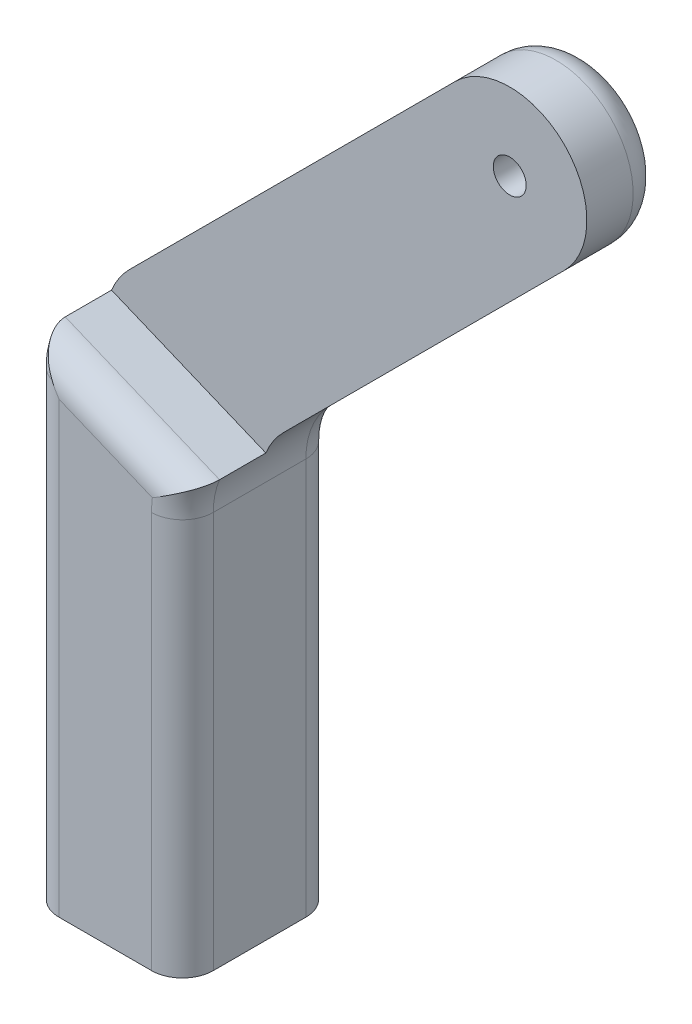
ISO-10303-21;
HEADER;
FILE_DESCRIPTION(('STEP AP214'),'2;1');
FILE_NAME('part.step','',(''),(''),'','','');
FILE_SCHEMA(('AUTOMOTIVE_DESIGN { 1 0 10303 214 1 1 1 1 }'));
ENDSEC;
DATA;
#1=APPLICATION_CONTEXT('core data for automotive mechanical design processes');
#2=APPLICATION_PROTOCOL_DEFINITION('international standard','automotive_design',2000,#1);
#3=PRODUCT_CONTEXT('',#1,'mechanical');
#4=PRODUCT('Part','Part','',(#3));
#5=PRODUCT_RELATED_PRODUCT_CATEGORY('part','',(#4));
#6=PRODUCT_DEFINITION_FORMATION('','',#4);
#7=PRODUCT_DEFINITION_CONTEXT('part definition',#1,'design');
#8=PRODUCT_DEFINITION('design','',#6,#7);
#9=PRODUCT_DEFINITION_SHAPE('','',#8);
#10=(LENGTH_UNIT() NAMED_UNIT(*) SI_UNIT(.MILLI.,.METRE.));
#11=(NAMED_UNIT(*) PLANE_ANGLE_UNIT() SI_UNIT($,.RADIAN.));
#12=(NAMED_UNIT(*) SI_UNIT($,.STERADIAN.) SOLID_ANGLE_UNIT());
#13=UNCERTAINTY_MEASURE_WITH_UNIT(LENGTH_MEASURE(1.E-05),#10,'distance_accuracy_value','');
#14=(GEOMETRIC_REPRESENTATION_CONTEXT(3) GLOBAL_UNCERTAINTY_ASSIGNED_CONTEXT((#13)) GLOBAL_UNIT_ASSIGNED_CONTEXT((#10,
#11,#12)) REPRESENTATION_CONTEXT('',''));
#15=CARTESIAN_POINT('',(0.,0.,0.));
#16=DIRECTION('',(0.,0.,1.));
#17=DIRECTION('',(1.,0.,0.));
#18=AXIS2_PLACEMENT_3D('',#15,#16,#17);
#19=CARTESIAN_POINT('',(152.915954276449,308.759522060909,-0.5));
#20=DIRECTION('',(0.,0.,1.));
#21=DIRECTION('',(1.,0.,0.));
#22=AXIS2_PLACEMENT_3D('',#19,#20,#21);
#23=CYLINDRICAL_SURFACE('',#22,1.59999999999999);
#24=CARTESIAN_POINT('',(152.915954276449,308.759522060909,7.5));
#25=DIRECTION('',(0.,0.,1.));
#26=DIRECTION('',(1.,0.,0.));
#27=AXIS2_PLACEMENT_3D('',#24,#25,#26);
#28=CIRCLE('',#27,1.59999999999999);
#29=CARTESIAN_POINT('',(154.515954276449,308.759522060909,7.5));
#30=VERTEX_POINT('',#29);
#31=EDGE_CURVE('E249',#30,#30,#28,.T.);
#32=ORIENTED_EDGE('',*,*,#31,.T.);
#33=EDGE_LOOP('',(#32));
#34=FACE_BOUND('',#33,.T.);
#35=CARTESIAN_POINT('',(152.915954276449,308.759522060909,3.));
#36=DIRECTION('',(0.,0.,-1.));
#37=DIRECTION('',(-1.,0.,0.));
#38=AXIS2_PLACEMENT_3D('',#35,#36,#37);
#39=CIRCLE('',#38,1.59999999999999);
#40=CARTESIAN_POINT('',(151.315954276449,308.759522060909,3.));
#41=VERTEX_POINT('',#40);
#42=EDGE_CURVE('E241',#41,#41,#39,.F.);
#43=ORIENTED_EDGE('',*,*,#42,.F.);
#44=EDGE_LOOP('',(#43));
#45=FACE_BOUND('',#44,.T.);
#46=ADVANCED_FACE('F35',(#34,#45),#23,.F.);
#47=CARTESIAN_POINT('',(130.939294873562,276.176260940224,15.));
#48=DIRECTION('',(-0.707106781186548,0.707106781186547,0.));
#49=DIRECTION('',(-0.707106781186547,-0.707106781186548,0.));
#50=AXIS2_PLACEMENT_3D('',#47,#48,#49);
#51=PLANE('',#50);
#52=DIRECTION('',(0.,0.,-1.));
#53=VECTOR('',#52,1.);
#54=CARTESIAN_POINT('',(130.939294873562,276.176260940224,15.));
#55=LINE('',#54,#53);
#56=CARTESIAN_POINT('',(130.939294873562,276.176260940224,7.5));
#57=VERTEX_POINT('',#56);
#58=CARTESIAN_POINT('',(130.939294873562,276.176260940224,3.));
#59=VERTEX_POINT('',#58);
#60=EDGE_CURVE('E292',#57,#59,#55,.T.);
#61=ORIENTED_EDGE('',*,*,#60,.T.);
#62=DIRECTION('',(0.707106781186547,0.707106781186548,0.));
#63=VECTOR('',#62,1.);
#64=CARTESIAN_POINT('',(130.939294873562,276.176260940224,3.));
#65=LINE('',#64,#63);
#66=CARTESIAN_POINT('',(158.219255135348,303.45622120201,3.));
#67=VERTEX_POINT('',#66);
#68=EDGE_CURVE('E344',#59,#67,#65,.T.);
#69=ORIENTED_EDGE('',*,*,#68,.T.);
#70=DIRECTION('',(0.,0.,-1.));
#71=VECTOR('',#70,1.);
#72=CARTESIAN_POINT('',(158.219255135348,303.45622120201,15.));
#73=LINE('',#72,#71);
#74=CARTESIAN_POINT('',(158.219255135348,303.45622120201,7.5));
#75=VERTEX_POINT('',#74);
#76=EDGE_CURVE('E289',#75,#67,#73,.T.);
#77=ORIENTED_EDGE('',*,*,#76,.F.);
#78=DIRECTION('',(0.707106781186546,0.707106781186549,0.));
#79=VECTOR('',#78,1.);
#80=CARTESIAN_POINT('',(130.939294873562,276.176260940224,7.5));
#81=LINE('',#80,#79);
#82=EDGE_CURVE('E260',#57,#75,#81,.T.);
#83=ORIENTED_EDGE('',*,*,#82,.F.);
#84=EDGE_LOOP('',(#61,#69,#77,#83));
#85=FACE_BOUND('',#84,.T.);
#86=ADVANCED_FACE('F451',(#85),#51,.F.);
#87=CARTESIAN_POINT('',(152.915954276449,308.759522060909,15.));
#88=DIRECTION('',(0.,0.,-1.));
#89=DIRECTION('',(-1.,0.,0.));
#90=AXIS2_PLACEMENT_3D('',#87,#88,#89);
#91=CYLINDRICAL_SURFACE('',#90,7.49999999999999);
#92=ORIENTED_EDGE('',*,*,#76,.T.);
#93=CARTESIAN_POINT('',(152.915954276449,308.759522060909,3.));
#94=DIRECTION('',(0.,0.,1.));
#95=DIRECTION('',(1.,0.,0.));
#96=AXIS2_PLACEMENT_3D('',#93,#94,#95);
#97=CIRCLE('',#96,7.49999999999999);
#98=CARTESIAN_POINT('',(147.61265341755,314.062822919808,3.));
#99=VERTEX_POINT('',#98);
#100=EDGE_CURVE('E342',#67,#99,#97,.T.);
#101=ORIENTED_EDGE('',*,*,#100,.T.);
#102=DIRECTION('',(0.,0.,-1.));
#103=VECTOR('',#102,1.);
#104=CARTESIAN_POINT('',(147.61265341755,314.062822919808,15.));
#105=LINE('',#104,#103);
#106=CARTESIAN_POINT('',(147.61265341755,314.062822919808,7.5));
#107=VERTEX_POINT('',#106);
#108=EDGE_CURVE('E286',#107,#99,#105,.T.);
#109=ORIENTED_EDGE('',*,*,#108,.F.);
#110=CARTESIAN_POINT('',(152.915954276449,308.759522060909,7.5));
#111=DIRECTION('',(0.,0.,1.));
#112=DIRECTION('',(1.,0.,0.));
#113=AXIS2_PLACEMENT_3D('',#110,#111,#112);
#114=CIRCLE('',#113,7.49999999999998);
#115=EDGE_CURVE('E262',#75,#107,#114,.T.);
#116=ORIENTED_EDGE('',*,*,#115,.F.);
#117=EDGE_LOOP('',(#92,#101,#109,#116));
#118=FACE_BOUND('',#117,.T.);
#119=ADVANCED_FACE('F468',(#118),#91,.T.);
#120=CARTESIAN_POINT('',(115.939294873562,282.38946437582,15.));
#121=DIRECTION('',(0.707106781186548,-0.707106781186547,0.));
#122=DIRECTION('',(0.707106781186547,0.707106781186548,0.));
#123=AXIS2_PLACEMENT_3D('',#120,#121,#122);
#124=PLANE('',#123);
#125=ORIENTED_EDGE('',*,*,#108,.T.);
#126=DIRECTION('',(-0.707106781186547,-0.707106781186548,0.));
#127=VECTOR('',#126,1.);
#128=CARTESIAN_POINT('',(115.939294873562,282.38946437582,3.));
#129=LINE('',#128,#127);
#130=CARTESIAN_POINT('',(115.939294873562,282.38946437582,3.));
#131=VERTEX_POINT('',#130);
#132=EDGE_CURVE('E340',#99,#131,#129,.T.);
#133=ORIENTED_EDGE('',*,*,#132,.T.);
#134=DIRECTION('',(0.,0.,-1.));
#135=VECTOR('',#134,1.);
#136=CARTESIAN_POINT('',(115.939294873562,282.38946437582,15.));
#137=LINE('',#136,#135);
#138=CARTESIAN_POINT('',(115.939294873562,282.38946437582,7.5));
#139=VERTEX_POINT('',#138);
#140=EDGE_CURVE('E281',#139,#131,#137,.T.);
#141=ORIENTED_EDGE('',*,*,#140,.F.);
#142=DIRECTION('',(-0.707106781186547,-0.707106781186548,0.));
#143=VECTOR('',#142,1.);
#144=CARTESIAN_POINT('',(147.61265341755,314.062822919808,7.5));
#145=LINE('',#144,#143);
#146=EDGE_CURVE('E264',#107,#139,#145,.T.);
#147=ORIENTED_EDGE('',*,*,#146,.F.);
#148=EDGE_LOOP('',(#125,#133,#141,#147));
#149=FACE_BOUND('',#148,.T.);
#150=ADVANCED_FACE('F472',(#149),#124,.F.);
#151=CARTESIAN_POINT('',(121.596149123054,276.732610126328,15.));
#152=DIRECTION('',(0.,0.,-1.));
#153=DIRECTION('',(-1.,0.,0.));
#154=AXIS2_PLACEMENT_3D('',#151,#152,#153);
#155=CYLINDRICAL_SURFACE('',#154,7.99999999999997);
#156=ORIENTED_EDGE('',*,*,#140,.T.);
#157=CARTESIAN_POINT('',(121.596149123054,276.732610126328,3.));
#158=DIRECTION('',(0.,0.,1.));
#159=DIRECTION('',(1.,0.,0.));
#160=AXIS2_PLACEMENT_3D('',#157,#158,#159);
#161=CIRCLE('',#160,7.99999999999997);
#162=CARTESIAN_POINT('',(113.596149123054,276.732610126328,3.));
#163=VERTEX_POINT('',#162);
#164=EDGE_CURVE('E338',#131,#163,#161,.T.);
#165=ORIENTED_EDGE('',*,*,#164,.T.);
#166=DIRECTION('',(0.,0.,-1.));
#167=VECTOR('',#166,1.);
#168=CARTESIAN_POINT('',(113.596149123054,276.732610126328,15.));
#169=LINE('',#168,#167);
#170=CARTESIAN_POINT('',(113.596149123054,276.732610126328,12.));
#171=VERTEX_POINT('',#170);
#172=EDGE_CURVE('E304',#171,#163,#169,.T.);
#173=ORIENTED_EDGE('',*,*,#172,.F.);
#174=CARTESIAN_POINT('',(121.596149123054,276.732610126328,12.));
#175=DIRECTION('',(0.,0.,1.));
#176=DIRECTION('',(1.,0.,0.));
#177=AXIS2_PLACEMENT_3D('',#174,#175,#176);
#178=CIRCLE('',#177,7.99999999999997);
#179=CARTESIAN_POINT('',(114.205112862964,279.794077585248,12.));
#180=VERTEX_POINT('',#179);
#181=EDGE_CURVE('E336',#171,#180,#178,.F.);
#182=ORIENTED_EDGE('',*,*,#181,.T.);
#183=DIRECTION('',(0.,0.,1.));
#184=VECTOR('',#183,1.);
#185=CARTESIAN_POINT('',(114.205112862964,279.794077585248,7.5));
#186=LINE('',#185,#184);
#187=CARTESIAN_POINT('',(114.205112862964,279.794077585248,7.5));
#188=VERTEX_POINT('',#187);
#189=EDGE_CURVE('E266',#188,#180,#186,.T.);
#190=ORIENTED_EDGE('',*,*,#189,.F.);
#191=CARTESIAN_POINT('',(121.596149123054,276.732610126328,7.5));
#192=DIRECTION('',(0.,0.,1.));
#193=DIRECTION('',(1.,0.,0.));
#194=AXIS2_PLACEMENT_3D('',#191,#192,#193);
#195=CIRCLE('',#194,7.99999999999997);
#196=EDGE_CURVE('E252',#139,#188,#195,.T.);
#197=ORIENTED_EDGE('',*,*,#196,.F.);
#198=EDGE_LOOP('',(#156,#165,#173,#182,#190,#197));
#199=FACE_BOUND('',#198,.T.);
#200=ADVANCED_FACE('F478',(#199),#155,.T.);
#201=CARTESIAN_POINT('',(113.596149123054,231.939716907514,15.));
#202=DIRECTION('',(1.,0.,0.));
#203=DIRECTION('',(0.,0.,-1.));
#204=AXIS2_PLACEMENT_3D('',#201,#202,#203);
#205=PLANE('',#204);
#206=ORIENTED_EDGE('',*,*,#172,.T.);
#207=DIRECTION('',(0.,-1.,0.));
#208=VECTOR('',#207,1.);
#209=CARTESIAN_POINT('',(113.596149123054,231.939716907514,3.));
#210=LINE('',#209,#208);
#211=CARTESIAN_POINT('',(113.596149123054,231.939716907514,3.));
#212=VERTEX_POINT('',#211);
#213=EDGE_CURVE('E311',#163,#212,#210,.T.);
#214=ORIENTED_EDGE('',*,*,#213,.T.);
#215=DIRECTION('',(0.,0.,-1.));
#216=VECTOR('',#215,1.);
#217=CARTESIAN_POINT('',(113.596149123054,231.939716907514,15.));
#218=LINE('',#217,#216);
#219=CARTESIAN_POINT('',(113.596149123054,231.939716907514,12.));
#220=VERTEX_POINT('',#219);
#221=EDGE_CURVE('E301',#220,#212,#218,.T.);
#222=ORIENTED_EDGE('',*,*,#221,.F.);
#223=DIRECTION('',(0.,-1.,0.));
#224=VECTOR('',#223,1.);
#225=CARTESIAN_POINT('',(113.596149123054,276.732610126328,12.));
#226=LINE('',#225,#224);
#227=EDGE_CURVE('E307',#220,#171,#226,.F.);
#228=ORIENTED_EDGE('',*,*,#227,.T.);
#229=EDGE_LOOP('',(#206,#214,#222,#228));
#230=FACE_BOUND('',#229,.T.);
#231=ADVANCED_FACE('F484',(#230),#205,.F.);
#232=CARTESIAN_POINT('',(113.596149123054,231.939716907514,15.));
#233=DIRECTION('',(0.,1.,0.));
#234=DIRECTION('',(0.,0.,1.));
#235=AXIS2_PLACEMENT_3D('',#232,#233,#234);
#236=PLANE('',#235);
#237=CARTESIAN_POINT('',(121.096149123054,231.939716907514,7.5));
#238=DIRECTION('',(0.,-1.,0.));
#239=DIRECTION('',(0.,0.,-1.));
#240=AXIS2_PLACEMENT_3D('',#237,#238,#239);
#241=CIRCLE('',#240,3.1);
#242=CARTESIAN_POINT('',(121.096149123054,231.939716907514,4.4));
#243=VERTEX_POINT('',#242);
#244=EDGE_CURVE('E270',#243,#243,#241,.T.);
#245=ORIENTED_EDGE('',*,*,#244,.F.);
#246=EDGE_LOOP('',(#245));
#247=FACE_BOUND('',#246,.T.);
#248=ORIENTED_EDGE('',*,*,#221,.T.);
#249=CARTESIAN_POINT('',(116.596149123054,231.939716907514,3.));
#250=DIRECTION('',(0.,1.,0.));
#251=DIRECTION('',(0.,0.,1.));
#252=AXIS2_PLACEMENT_3D('',#249,#250,#251);
#253=CIRCLE('',#252,3.);
#254=CARTESIAN_POINT('',(116.596149123054,231.939716907514,0.));
#255=VERTEX_POINT('',#254);
#256=EDGE_CURVE('E320',#212,#255,#253,.F.);
#257=ORIENTED_EDGE('',*,*,#256,.T.);
#258=DIRECTION('',(1.,0.,0.));
#259=VECTOR('',#258,1.);
#260=CARTESIAN_POINT('',(113.596149123054,231.939716907514,0.));
#261=LINE('',#260,#259);
#262=CARTESIAN_POINT('',(125.596149123054,231.939716907514,0.));
#263=VERTEX_POINT('',#262);
#264=EDGE_CURVE('E276',#255,#263,#261,.T.);
#265=ORIENTED_EDGE('',*,*,#264,.T.);
#266=CARTESIAN_POINT('',(125.596149123054,231.939716907514,3.));
#267=DIRECTION('',(0.,1.,0.));
#268=DIRECTION('',(0.,0.,1.));
#269=AXIS2_PLACEMENT_3D('',#266,#267,#268);
#270=CIRCLE('',#269,3.);
#271=CARTESIAN_POINT('',(128.596149123054,231.939716907514,3.));
#272=VERTEX_POINT('',#271);
#273=EDGE_CURVE('E318',#263,#272,#270,.F.);
#274=ORIENTED_EDGE('',*,*,#273,.T.);
#275=DIRECTION('',(0.,0.,-1.));
#276=VECTOR('',#275,1.);
#277=CARTESIAN_POINT('',(128.596149123054,231.939716907514,15.));
#278=LINE('',#277,#276);
#279=CARTESIAN_POINT('',(128.596149123054,231.939716907514,12.));
#280=VERTEX_POINT('',#279);
#281=EDGE_CURVE('E298',#280,#272,#278,.T.);
#282=ORIENTED_EDGE('',*,*,#281,.F.);
#283=CARTESIAN_POINT('',(125.596149123054,231.939716907514,12.));
#284=DIRECTION('',(0.,1.,0.));
#285=DIRECTION('',(0.,0.,1.));
#286=AXIS2_PLACEMENT_3D('',#283,#284,#285);
#287=CIRCLE('',#286,3.);
#288=CARTESIAN_POINT('',(125.596149123054,231.939716907514,15.));
#289=VERTEX_POINT('',#288);
#290=EDGE_CURVE('E316',#280,#289,#287,.F.);
#291=ORIENTED_EDGE('',*,*,#290,.T.);
#292=DIRECTION('',(1.,0.,0.));
#293=VECTOR('',#292,1.);
#294=CARTESIAN_POINT('',(113.596149123054,231.939716907514,15.));
#295=LINE('',#294,#293);
#296=CARTESIAN_POINT('',(116.596149123054,231.939716907514,15.));
#297=VERTEX_POINT('',#296);
#298=EDGE_CURVE('E279',#297,#289,#295,.T.);
#299=ORIENTED_EDGE('',*,*,#298,.F.);
#300=CARTESIAN_POINT('',(116.596149123054,231.939716907514,12.));
#301=DIRECTION('',(0.,1.,0.));
#302=DIRECTION('',(0.,0.,1.));
#303=AXIS2_PLACEMENT_3D('',#300,#301,#302);
#304=CIRCLE('',#303,3.);
#305=EDGE_CURVE('E314',#297,#220,#304,.F.);
#306=ORIENTED_EDGE('',*,*,#305,.T.);
#307=EDGE_LOOP('',(#248,#257,#265,#274,#282,#291,#299,#306));
#308=FACE_BOUND('',#307,.T.);
#309=ADVANCED_FACE('F438',(#247,#308),#236,.F.);
#310=CARTESIAN_POINT('',(128.596149123054,231.939716907514,15.));
#311=DIRECTION('',(-1.,0.,0.));
#312=DIRECTION('',(0.,0.,1.));
#313=AXIS2_PLACEMENT_3D('',#310,#311,#312);
#314=PLANE('',#313);
#315=ORIENTED_EDGE('',*,*,#281,.T.);
#316=DIRECTION('',(0.,1.,0.));
#317=VECTOR('',#316,1.);
#318=CARTESIAN_POINT('',(128.596149123054,231.939716907514,3.));
#319=LINE('',#318,#317);
#320=CARTESIAN_POINT('',(128.596149123054,270.519406690731,3.));
#321=VERTEX_POINT('',#320);
#322=EDGE_CURVE('E45',#272,#321,#319,.T.);
#323=ORIENTED_EDGE('',*,*,#322,.T.);
#324=DIRECTION('',(0.,0.,-1.));
#325=VECTOR('',#324,1.);
#326=CARTESIAN_POINT('',(128.596149123054,270.519406690731,15.));
#327=LINE('',#326,#325);
#328=CARTESIAN_POINT('',(128.596149123054,270.519406690731,12.));
#329=VERTEX_POINT('',#328);
#330=EDGE_CURVE('E295',#329,#321,#327,.T.);
#331=ORIENTED_EDGE('',*,*,#330,.F.);
#332=DIRECTION('',(0.,1.,0.));
#333=VECTOR('',#332,1.);
#334=CARTESIAN_POINT('',(128.596149123054,231.939716907514,12.));
#335=LINE('',#334,#333);
#336=EDGE_CURVE('E357',#329,#280,#335,.F.);
#337=ORIENTED_EDGE('',*,*,#336,.T.);
#338=EDGE_LOOP('',(#315,#323,#331,#337));
#339=FACE_BOUND('',#338,.T.);
#340=ADVANCED_FACE('F435',(#339),#314,.F.);
#341=CARTESIAN_POINT('',(136.596149123054,270.519406690731,15.));
#342=DIRECTION('',(0.,0.,-1.));
#343=DIRECTION('',(-1.,0.,0.));
#344=AXIS2_PLACEMENT_3D('',#341,#342,#343);
#345=CYLINDRICAL_SURFACE('',#344,7.99999999999999);
#346=ORIENTED_EDGE('',*,*,#330,.T.);
#347=CARTESIAN_POINT('',(136.596149123054,270.519406690731,3.));
#348=DIRECTION('',(0.,0.,1.));
#349=DIRECTION('',(1.,0.,0.));
#350=AXIS2_PLACEMENT_3D('',#347,#348,#349);
#351=CIRCLE('',#350,7.99999999999999);
#352=EDGE_CURVE('E348',#321,#59,#351,.F.);
#353=ORIENTED_EDGE('',*,*,#352,.T.);
#354=ORIENTED_EDGE('',*,*,#60,.F.);
#355=CARTESIAN_POINT('',(136.596149123054,270.519406690731,7.5));
#356=DIRECTION('',(0.,0.,-1.));
#357=DIRECTION('',(1.,0.,0.));
#358=AXIS2_PLACEMENT_3D('',#355,#356,#357);
#359=CIRCLE('',#358,7.99999999999998);
#360=CARTESIAN_POINT('',(129.205112862964,273.580874149652,7.5));
#361=VERTEX_POINT('',#360);
#362=EDGE_CURVE('E258',#361,#57,#359,.T.);
#363=ORIENTED_EDGE('',*,*,#362,.F.);
#364=DIRECTION('',(0.,0.,1.));
#365=VECTOR('',#364,1.);
#366=CARTESIAN_POINT('',(129.205112862964,273.580874149652,7.5));
#367=LINE('',#366,#365);
#368=CARTESIAN_POINT('',(129.205112862964,273.580874149652,12.));
#369=VERTEX_POINT('',#368);
#370=EDGE_CURVE('E267',#361,#369,#367,.T.);
#371=ORIENTED_EDGE('',*,*,#370,.T.);
#372=CARTESIAN_POINT('',(136.596149123054,270.519406690731,12.));
#373=DIRECTION('',(0.,0.,1.));
#374=DIRECTION('',(1.,0.,0.));
#375=AXIS2_PLACEMENT_3D('',#372,#373,#374);
#376=CIRCLE('',#375,7.99999999999999);
#377=EDGE_CURVE('E346',#369,#329,#376,.T.);
#378=ORIENTED_EDGE('',*,*,#377,.T.);
#379=EDGE_LOOP('',(#346,#353,#354,#363,#371,#378));
#380=FACE_BOUND('',#379,.T.);
#381=ADVANCED_FACE('F424',(#380),#345,.F.);
#382=CARTESIAN_POINT('',(121.596149123054,276.732610126328,15.));
#383=DIRECTION('',(0.,0.,1.));
#384=DIRECTION('',(1.,0.,0.));
#385=AXIS2_PLACEMENT_3D('',#382,#383,#384);
#386=PLANE('',#385);
#387=ORIENTED_EDGE('',*,*,#298,.T.);
#388=DIRECTION('',(0.,1.,0.));
#389=VECTOR('',#388,1.);
#390=CARTESIAN_POINT('',(125.596149123054,270.519406690731,15.));
#391=LINE('',#390,#389);
#392=CARTESIAN_POINT('',(125.596149123054,270.519406690731,15.));
#393=VERTEX_POINT('',#392);
#394=EDGE_CURVE('E53',#289,#393,#391,.T.);
#395=ORIENTED_EDGE('',*,*,#394,.T.);
#396=CARTESIAN_POINT('',(136.596149123054,270.519406690731,15.));
#397=DIRECTION('',(0.,0.,1.));
#398=DIRECTION('',(1.,0.,0.));
#399=AXIS2_PLACEMENT_3D('',#396,#397,#398);
#400=CIRCLE('',#399,11.);
#401=CARTESIAN_POINT('',(125.670676888329,271.797708864808,15.));
#402=VERTEX_POINT('',#401);
#403=EDGE_CURVE('E354',#393,#402,#400,.F.);
#404=ORIENTED_EDGE('',*,*,#403,.T.);
#405=DIRECTION('',(0.923879532511286,-0.382683432365091,0.));
#406=VECTOR('',#405,1.);
#407=CARTESIAN_POINT('',(113.057062565869,277.022438987715,15.));
#408=LINE('',#407,#406);
#409=CARTESIAN_POINT('',(116.596149123054,275.556501337316,15.));
#410=VERTEX_POINT('',#409);
#411=EDGE_CURVE('E352',#402,#410,#408,.F.);
#412=ORIENTED_EDGE('',*,*,#411,.T.);
#413=DIRECTION('',(0.,-1.,0.));
#414=VECTOR('',#413,1.);
#415=CARTESIAN_POINT('',(116.596149123054,231.939716907514,15.));
#416=LINE('',#415,#414);
#417=EDGE_CURVE('E350',#410,#297,#416,.T.);
#418=ORIENTED_EDGE('',*,*,#417,.T.);
#419=EDGE_LOOP('',(#387,#395,#404,#412,#418));
#420=FACE_BOUND('',#419,.T.);
#421=ADVANCED_FACE('F530',(#420),#386,.T.);
#422=CARTESIAN_POINT('',(121.596149123054,276.732610126328,0.));
#423=DIRECTION('',(0.,0.,1.));
#424=DIRECTION('',(1.,0.,0.));
#425=AXIS2_PLACEMENT_3D('',#422,#423,#424);
#426=PLANE('',#425);
#427=DIRECTION('',(0.499999999999996,0.866025403784441,0.));
#428=VECTOR('',#427,1.);
#429=CARTESIAN_POINT('',(149.682792768987,308.759522060909,0.));
#430=LINE('',#429,#428);
#431=CARTESIAN_POINT('',(149.682792768987,308.759522060909,0.));
#432=VERTEX_POINT('',#431);
#433=CARTESIAN_POINT('',(151.299373522718,311.559522060909,0.));
#434=VERTEX_POINT('',#433);
#435=EDGE_CURVE('E228',#432,#434,#430,.T.);
#436=ORIENTED_EDGE('',*,*,#435,.F.);
#437=DIRECTION('',(-0.500000000000001,0.866025403784438,0.));
#438=VECTOR('',#437,1.);
#439=CARTESIAN_POINT('',(151.299373522718,305.959522060909,0.));
#440=LINE('',#439,#438);
#441=CARTESIAN_POINT('',(151.299373522718,305.959522060909,0.));
#442=VERTEX_POINT('',#441);
#443=EDGE_CURVE('E195',#442,#432,#440,.T.);
#444=ORIENTED_EDGE('',*,*,#443,.F.);
#445=DIRECTION('',(-1.,0.,0.));
#446=VECTOR('',#445,1.);
#447=CARTESIAN_POINT('',(154.53253503018,305.959522060909,0.));
#448=LINE('',#447,#446);
#449=CARTESIAN_POINT('',(154.53253503018,305.959522060909,0.));
#450=VERTEX_POINT('',#449);
#451=EDGE_CURVE('E214',#450,#442,#448,.T.);
#452=ORIENTED_EDGE('',*,*,#451,.F.);
#453=DIRECTION('',(-0.499999999999995,-0.866025403784441,0.));
#454=VECTOR('',#453,1.);
#455=CARTESIAN_POINT('',(156.149115783911,308.759522060909,0.));
#456=LINE('',#455,#454);
#457=CARTESIAN_POINT('',(156.149115783911,308.759522060909,0.));
#458=VERTEX_POINT('',#457);
#459=EDGE_CURVE('E217',#458,#450,#456,.T.);
#460=ORIENTED_EDGE('',*,*,#459,.F.);
#461=DIRECTION('',(0.499999999999996,-0.866025403784441,0.));
#462=VECTOR('',#461,1.);
#463=CARTESIAN_POINT('',(154.53253503018,311.559522060909,0.));
#464=LINE('',#463,#462);
#465=CARTESIAN_POINT('',(154.53253503018,311.559522060909,0.));
#466=VERTEX_POINT('',#465);
#467=EDGE_CURVE('E234',#466,#458,#464,.T.);
#468=ORIENTED_EDGE('',*,*,#467,.F.);
#469=DIRECTION('',(1.,0.,0.));
#470=VECTOR('',#469,1.);
#471=CARTESIAN_POINT('',(151.299373522718,311.559522060909,0.));
#472=LINE('',#471,#470);
#473=EDGE_CURVE('E231',#434,#466,#472,.T.);
#474=ORIENTED_EDGE('',*,*,#473,.F.);
#475=EDGE_LOOP('',(#436,#444,#452,#460,#468,#474));
#476=FACE_BOUND('',#475,.T.);
#477=ORIENTED_EDGE('',*,*,#264,.F.);
#478=DIRECTION('',(0.,-1.,0.));
#479=VECTOR('',#478,1.);
#480=CARTESIAN_POINT('',(116.596149123054,276.732610126328,0.));
#481=LINE('',#480,#479);
#482=CARTESIAN_POINT('',(116.596149123054,276.732610126328,0.));
#483=VERTEX_POINT('',#482);
#484=EDGE_CURVE('E334',#255,#483,#481,.F.);
#485=ORIENTED_EDGE('',*,*,#484,.T.);
#486=CARTESIAN_POINT('',(121.596149123054,276.732610126328,0.));
#487=DIRECTION('',(0.,0.,1.));
#488=DIRECTION('',(1.,0.,0.));
#489=AXIS2_PLACEMENT_3D('',#486,#487,#488);
#490=CIRCLE('',#489,4.99999999999997);
#491=CARTESIAN_POINT('',(118.060615217122,280.26814403226,0.));
#492=VERTEX_POINT('',#491);
#493=EDGE_CURVE('E332',#483,#492,#490,.F.);
#494=ORIENTED_EDGE('',*,*,#493,.T.);
#495=DIRECTION('',(-0.707106781186547,-0.707106781186548,0.));
#496=VECTOR('',#495,1.);
#497=CARTESIAN_POINT('',(118.060615217122,280.26814403226,0.));
#498=LINE('',#497,#496);
#499=CARTESIAN_POINT('',(149.73397376111,311.941502576248,0.));
#500=VERTEX_POINT('',#499);
#501=EDGE_CURVE('E330',#492,#500,#498,.F.);
#502=ORIENTED_EDGE('',*,*,#501,.T.);
#503=CARTESIAN_POINT('',(152.915954276449,308.759522060909,0.));
#504=DIRECTION('',(0.,0.,1.));
#505=DIRECTION('',(1.,0.,0.));
#506=AXIS2_PLACEMENT_3D('',#503,#504,#505);
#507=CIRCLE('',#506,4.49999999999999);
#508=CARTESIAN_POINT('',(156.097934791788,305.577541545569,0.));
#509=VERTEX_POINT('',#508);
#510=EDGE_CURVE('E328',#500,#509,#507,.F.);
#511=ORIENTED_EDGE('',*,*,#510,.T.);
#512=DIRECTION('',(0.707106781186547,0.707106781186548,0.));
#513=VECTOR('',#512,1.);
#514=CARTESIAN_POINT('',(124.424576247801,273.904183001582,0.));
#515=LINE('',#514,#513);
#516=CARTESIAN_POINT('',(128.817974530002,278.297581283783,0.));
#517=VERTEX_POINT('',#516);
#518=EDGE_CURVE('E326',#509,#517,#515,.F.);
#519=ORIENTED_EDGE('',*,*,#518,.T.);
#520=CARTESIAN_POINT('',(136.596149123054,270.519406690731,0.));
#521=DIRECTION('',(0.,0.,1.));
#522=DIRECTION('',(1.,0.,0.));
#523=AXIS2_PLACEMENT_3D('',#520,#521,#522);
#524=CIRCLE('',#523,11.);
#525=CARTESIAN_POINT('',(125.596149123054,270.519406690731,0.));
#526=VERTEX_POINT('',#525);
#527=EDGE_CURVE('E324',#517,#526,#524,.T.);
#528=ORIENTED_EDGE('',*,*,#527,.T.);
#529=DIRECTION('',(0.,1.,0.));
#530=VECTOR('',#529,1.);
#531=CARTESIAN_POINT('',(125.596149123054,276.732610126328,0.));
#532=LINE('',#531,#530);
#533=EDGE_CURVE('E322',#526,#263,#532,.F.);
#534=ORIENTED_EDGE('',*,*,#533,.T.);
#535=EDGE_LOOP('',(#477,#485,#494,#502,#511,#519,#528,#534));
#536=FACE_BOUND('',#535,.T.);
#537=ADVANCED_FACE('F494',(#476,#536),#426,.F.);
#538=CARTESIAN_POINT('',(121.096149123054,243.939716907514,7.5));
#539=DIRECTION('',(0.,-1.,0.));
#540=DIRECTION('',(0.,0.,-1.));
#541=AXIS2_PLACEMENT_3D('',#538,#539,#540);
#542=CYLINDRICAL_SURFACE('',#541,3.1);
#543=CARTESIAN_POINT('',(121.096149123054,243.939716907514,7.5));
#544=DIRECTION('',(0.,-1.,0.));
#545=DIRECTION('',(0.,0.,-1.));
#546=AXIS2_PLACEMENT_3D('',#543,#544,#545);
#547=CIRCLE('',#546,3.1);
#548=CARTESIAN_POINT('',(121.096149123054,243.939716907514,4.4));
#549=VERTEX_POINT('',#548);
#550=EDGE_CURVE('E273',#549,#549,#547,.T.);
#551=ORIENTED_EDGE('',*,*,#550,.F.);
#552=EDGE_LOOP('',(#551));
#553=FACE_BOUND('',#552,.T.);
#554=ORIENTED_EDGE('',*,*,#244,.T.);
#555=EDGE_LOOP('',(#554));
#556=FACE_BOUND('',#555,.T.);
#557=ADVANCED_FACE('F525',(#553,#556),#542,.F.);
#558=CARTESIAN_POINT('',(121.096149123054,243.939716907514,7.5));
#559=DIRECTION('',(0.,-1.,0.));
#560=DIRECTION('',(0.,0.,-1.));
#561=AXIS2_PLACEMENT_3D('',#558,#559,#560);
#562=PLANE('',#561);
#563=ORIENTED_EDGE('',*,*,#550,.T.);
#564=EDGE_LOOP('',(#563));
#565=FACE_BOUND('',#564,.T.);
#566=ADVANCED_FACE('F522',(#565),#562,.T.);
#567=CARTESIAN_POINT('',(114.205112862964,279.794077585248,7.5));
#568=DIRECTION('',(-0.382683432365091,-0.923879532511286,0.));
#569=DIRECTION('',(0.923879532511286,-0.382683432365091,0.));
#570=AXIS2_PLACEMENT_3D('',#567,#568,#569);
#571=PLANE('',#570);
#572=ORIENTED_EDGE('',*,*,#189,.T.);
#573=DIRECTION('',(0.923879532511286,-0.382683432365091,0.));
#574=VECTOR('',#573,1.);
#575=CARTESIAN_POINT('',(129.205112862964,273.580874149652,12.));
#576=LINE('',#575,#574);
#577=EDGE_CURVE('E11',#180,#369,#576,.T.);
#578=ORIENTED_EDGE('',*,*,#577,.T.);
#579=ORIENTED_EDGE('',*,*,#370,.F.);
#580=DIRECTION('',(0.923879532511286,-0.382683432365091,0.));
#581=VECTOR('',#580,1.);
#582=CARTESIAN_POINT('',(114.205112862964,279.794077585248,7.5));
#583=LINE('',#582,#581);
#584=EDGE_CURVE('E255',#188,#361,#583,.T.);
#585=ORIENTED_EDGE('',*,*,#584,.F.);
#586=EDGE_LOOP('',(#572,#578,#579,#585));
#587=FACE_BOUND('',#586,.T.);
#588=ADVANCED_FACE('F419',(#587),#571,.F.);
#589=CARTESIAN_POINT('',(121.596149123054,276.732610126328,7.5));
#590=DIRECTION('',(0.,0.,1.));
#591=DIRECTION('',(1.,0.,0.));
#592=AXIS2_PLACEMENT_3D('',#589,#590,#591);
#593=PLANE('',#592);
#594=ORIENTED_EDGE('',*,*,#31,.F.);
#595=EDGE_LOOP('',(#594));
#596=FACE_BOUND('',#595,.T.);
#597=ORIENTED_EDGE('',*,*,#196,.T.);
#598=ORIENTED_EDGE('',*,*,#584,.T.);
#599=ORIENTED_EDGE('',*,*,#362,.T.);
#600=ORIENTED_EDGE('',*,*,#82,.T.);
#601=ORIENTED_EDGE('',*,*,#115,.T.);
#602=ORIENTED_EDGE('',*,*,#146,.T.);
#603=EDGE_LOOP('',(#597,#598,#599,#600,#601,#602));
#604=FACE_BOUND('',#603,.T.);
#605=ADVANCED_FACE('F476',(#596,#604),#593,.T.);
#606=CARTESIAN_POINT('',(0.,0.,3.));
#607=DIRECTION('',(0.,0.,-1.));
#608=DIRECTION('',(-1.,0.,0.));
#609=AXIS2_PLACEMENT_3D('',#606,#607,#608);
#610=PLANE('',#609);
#611=DIRECTION('',(-0.500000000000001,0.866025403784438,0.));
#612=VECTOR('',#611,1.);
#613=CARTESIAN_POINT('',(151.299373522718,305.959522060909,3.));
#614=LINE('',#613,#612);
#615=CARTESIAN_POINT('',(151.299373522718,305.959522060909,3.));
#616=VERTEX_POINT('',#615);
#617=CARTESIAN_POINT('',(149.682792768987,308.759522060909,3.));
#618=VERTEX_POINT('',#617);
#619=EDGE_CURVE('E192',#616,#618,#614,.T.);
#620=ORIENTED_EDGE('',*,*,#619,.T.);
#621=DIRECTION('',(0.499999999999996,0.866025403784441,0.));
#622=VECTOR('',#621,1.);
#623=CARTESIAN_POINT('',(149.682792768987,308.759522060909,3.));
#624=LINE('',#623,#622);
#625=CARTESIAN_POINT('',(151.299373522718,311.559522060909,3.));
#626=VERTEX_POINT('',#625);
#627=EDGE_CURVE('E203',#618,#626,#624,.T.);
#628=ORIENTED_EDGE('',*,*,#627,.T.);
#629=DIRECTION('',(1.,0.,0.));
#630=VECTOR('',#629,1.);
#631=CARTESIAN_POINT('',(151.299373522718,311.559522060909,3.));
#632=LINE('',#631,#630);
#633=CARTESIAN_POINT('',(154.53253503018,311.559522060909,3.));
#634=VERTEX_POINT('',#633);
#635=EDGE_CURVE('E208',#626,#634,#632,.T.);
#636=ORIENTED_EDGE('',*,*,#635,.T.);
#637=DIRECTION('',(0.499999999999996,-0.866025403784441,0.));
#638=VECTOR('',#637,1.);
#639=CARTESIAN_POINT('',(154.53253503018,311.559522060909,3.));
#640=LINE('',#639,#638);
#641=CARTESIAN_POINT('',(156.149115783911,308.759522060909,3.));
#642=VERTEX_POINT('',#641);
#643=EDGE_CURVE('E221',#634,#642,#640,.T.);
#644=ORIENTED_EDGE('',*,*,#643,.T.);
#645=DIRECTION('',(-0.499999999999995,-0.866025403784441,0.));
#646=VECTOR('',#645,1.);
#647=CARTESIAN_POINT('',(156.149115783911,308.759522060909,3.));
#648=LINE('',#647,#646);
#649=CARTESIAN_POINT('',(154.53253503018,305.959522060909,3.));
#650=VERTEX_POINT('',#649);
#651=EDGE_CURVE('E224',#642,#650,#648,.T.);
#652=ORIENTED_EDGE('',*,*,#651,.T.);
#653=DIRECTION('',(-1.,0.,0.));
#654=VECTOR('',#653,1.);
#655=CARTESIAN_POINT('',(154.53253503018,305.959522060909,3.));
#656=LINE('',#655,#654);
#657=EDGE_CURVE('E200',#650,#616,#656,.T.);
#658=ORIENTED_EDGE('',*,*,#657,.T.);
#659=EDGE_LOOP('',(#620,#628,#636,#644,#652,#658));
#660=FACE_BOUND('',#659,.T.);
#661=ORIENTED_EDGE('',*,*,#42,.T.);
#662=EDGE_LOOP('',(#661));
#663=FACE_BOUND('',#662,.T.);
#664=ADVANCED_FACE('F210',(#660,#663),#610,.T.);
#665=CARTESIAN_POINT('',(151.299373522718,305.959522060909,3.));
#666=DIRECTION('',(-0.866025403784438,-0.500000000000002,0.));
#667=DIRECTION('',(0.500000000000002,-0.866025403784438,0.));
#668=AXIS2_PLACEMENT_3D('',#665,#666,#667);
#669=PLANE('',#668);
#670=ORIENTED_EDGE('',*,*,#443,.T.);
#671=DIRECTION('',(0.,0.,-1.));
#672=VECTOR('',#671,1.);
#673=CARTESIAN_POINT('',(149.682792768987,308.759522060909,3.));
#674=LINE('',#673,#672);
#675=EDGE_CURVE('E188',#618,#432,#674,.T.);
#676=ORIENTED_EDGE('',*,*,#675,.F.);
#677=ORIENTED_EDGE('',*,*,#619,.F.);
#678=DIRECTION('',(0.,0.,-1.));
#679=VECTOR('',#678,1.);
#680=CARTESIAN_POINT('',(151.299373522718,305.959522060909,3.));
#681=LINE('',#680,#679);
#682=EDGE_CURVE('E239',#616,#442,#681,.T.);
#683=ORIENTED_EDGE('',*,*,#682,.T.);
#684=EDGE_LOOP('',(#670,#676,#677,#683));
#685=FACE_BOUND('',#684,.T.);
#686=ADVANCED_FACE('F190',(#685),#669,.F.);
#687=CARTESIAN_POINT('',(154.53253503018,305.959522060909,3.));
#688=DIRECTION('',(0.,-1.,0.));
#689=DIRECTION('',(0.,0.,-1.));
#690=AXIS2_PLACEMENT_3D('',#687,#688,#689);
#691=PLANE('',#690);
#692=ORIENTED_EDGE('',*,*,#451,.T.);
#693=ORIENTED_EDGE('',*,*,#682,.F.);
#694=ORIENTED_EDGE('',*,*,#657,.F.);
#695=DIRECTION('',(0.,0.,-1.));
#696=VECTOR('',#695,1.);
#697=CARTESIAN_POINT('',(154.53253503018,305.959522060909,3.));
#698=LINE('',#697,#696);
#699=EDGE_CURVE('E242',#650,#450,#698,.T.);
#700=ORIENTED_EDGE('',*,*,#699,.T.);
#701=EDGE_LOOP('',(#692,#693,#694,#700));
#702=FACE_BOUND('',#701,.T.);
#703=ADVANCED_FACE('F659',(#702),#691,.F.);
#704=CARTESIAN_POINT('',(156.149115783911,308.759522060909,3.));
#705=DIRECTION('',(0.866025403784441,-0.499999999999995,0.));
#706=DIRECTION('',(0.499999999999995,0.866025403784441,0.));
#707=AXIS2_PLACEMENT_3D('',#704,#705,#706);
#708=PLANE('',#707);
#709=ORIENTED_EDGE('',*,*,#459,.T.);
#710=ORIENTED_EDGE('',*,*,#699,.F.);
#711=ORIENTED_EDGE('',*,*,#651,.F.);
#712=DIRECTION('',(0.,0.,-1.));
#713=VECTOR('',#712,1.);
#714=CARTESIAN_POINT('',(156.149115783911,308.759522060909,3.));
#715=LINE('',#714,#713);
#716=EDGE_CURVE('E244',#642,#458,#715,.T.);
#717=ORIENTED_EDGE('',*,*,#716,.T.);
#718=EDGE_LOOP('',(#709,#710,#711,#717));
#719=FACE_BOUND('',#718,.T.);
#720=ADVANCED_FACE('F650',(#719),#708,.F.);
#721=CARTESIAN_POINT('',(154.53253503018,311.559522060909,3.));
#722=DIRECTION('',(0.866025403784441,0.499999999999996,0.));
#723=DIRECTION('',(-0.499999999999996,0.866025403784441,0.));
#724=AXIS2_PLACEMENT_3D('',#721,#722,#723);
#725=PLANE('',#724);
#726=ORIENTED_EDGE('',*,*,#467,.T.);
#727=ORIENTED_EDGE('',*,*,#716,.F.);
#728=ORIENTED_EDGE('',*,*,#643,.F.);
#729=DIRECTION('',(0.,0.,-1.));
#730=VECTOR('',#729,1.);
#731=CARTESIAN_POINT('',(154.53253503018,311.559522060909,3.));
#732=LINE('',#731,#730);
#733=EDGE_CURVE('E246',#634,#466,#732,.T.);
#734=ORIENTED_EDGE('',*,*,#733,.T.);
#735=EDGE_LOOP('',(#726,#727,#728,#734));
#736=FACE_BOUND('',#735,.T.);
#737=ADVANCED_FACE('F641',(#736),#725,.F.);
#738=CARTESIAN_POINT('',(151.299373522718,311.559522060909,3.));
#739=DIRECTION('',(0.,1.,0.));
#740=DIRECTION('',(0.,0.,1.));
#741=AXIS2_PLACEMENT_3D('',#738,#739,#740);
#742=PLANE('',#741);
#743=ORIENTED_EDGE('',*,*,#473,.T.);
#744=ORIENTED_EDGE('',*,*,#733,.F.);
#745=ORIENTED_EDGE('',*,*,#635,.F.);
#746=DIRECTION('',(0.,0.,-1.));
#747=VECTOR('',#746,1.);
#748=CARTESIAN_POINT('',(151.299373522718,311.559522060909,3.));
#749=LINE('',#748,#747);
#750=EDGE_CURVE('E199',#626,#434,#749,.T.);
#751=ORIENTED_EDGE('',*,*,#750,.T.);
#752=EDGE_LOOP('',(#743,#744,#745,#751));
#753=FACE_BOUND('',#752,.T.);
#754=ADVANCED_FACE('F633',(#753),#742,.F.);
#755=CARTESIAN_POINT('',(149.682792768987,308.759522060909,3.));
#756=DIRECTION('',(-0.866025403784441,0.499999999999996,0.));
#757=DIRECTION('',(-0.499999999999996,-0.866025403784441,0.));
#758=AXIS2_PLACEMENT_3D('',#755,#756,#757);
#759=PLANE('',#758);
#760=ORIENTED_EDGE('',*,*,#435,.T.);
#761=ORIENTED_EDGE('',*,*,#750,.F.);
#762=ORIENTED_EDGE('',*,*,#627,.F.);
#763=ORIENTED_EDGE('',*,*,#675,.T.);
#764=EDGE_LOOP('',(#760,#761,#762,#763));
#765=FACE_BOUND('',#764,.T.);
#766=ADVANCED_FACE('F204',(#765),#759,.F.);
#767=CARTESIAN_POINT('',(125.596149123054,231.939716907514,3.));
#768=DIRECTION('',(0.,1.,0.));
#769=DIRECTION('',(0.,0.,1.));
#770=AXIS2_PLACEMENT_3D('',#767,#768,#769);
#771=CYLINDRICAL_SURFACE('',#770,3.);
#772=ORIENTED_EDGE('',*,*,#273,.F.);
#773=ORIENTED_EDGE('',*,*,#533,.F.);
#774=CARTESIAN_POINT('',(125.596149123054,270.519406690731,3.));
#775=DIRECTION('',(0.,1.,0.));
#776=DIRECTION('',(0.,0.,1.));
#777=AXIS2_PLACEMENT_3D('',#774,#775,#776);
#778=CIRCLE('',#777,3.);
#779=EDGE_CURVE('E229',#321,#526,#778,.T.);
#780=ORIENTED_EDGE('',*,*,#779,.F.);
#781=ORIENTED_EDGE('',*,*,#322,.F.);
#782=EDGE_LOOP('',(#772,#773,#780,#781));
#783=FACE_BOUND('',#782,.T.);
#784=ADVANCED_FACE('F444',(#783),#771,.T.);
#785=CARTESIAN_POINT('',(136.596149123054,270.519406690731,3.));
#786=DIRECTION('',(0.,0.,1.));
#787=DIRECTION('',(1.,0.,0.));
#788=AXIS2_PLACEMENT_3D('',#785,#786,#787);
#789=TOROIDAL_SURFACE('',#788,11.,3.);
#790=ORIENTED_EDGE('',*,*,#779,.T.);
#791=ORIENTED_EDGE('',*,*,#527,.F.);
#792=CARTESIAN_POINT('',(128.817974530002,278.297581283783,3.));
#793=DIRECTION('',(0.707106781186552,0.707106781186543,0.));
#794=DIRECTION('',(-0.707106781186543,0.707106781186552,0.));
#795=AXIS2_PLACEMENT_3D('',#792,#793,#794);
#796=CIRCLE('',#795,3.);
#797=EDGE_CURVE('E372',#59,#517,#796,.T.);
#798=ORIENTED_EDGE('',*,*,#797,.F.);
#799=ORIENTED_EDGE('',*,*,#352,.F.);
#800=EDGE_LOOP('',(#790,#791,#798,#799));
#801=FACE_BOUND('',#800,.T.);
#802=ADVANCED_FACE('F455',(#801),#789,.T.);
#803=CARTESIAN_POINT('',(128.817974530002,278.297581283783,3.));
#804=DIRECTION('',(0.707106781186547,0.707106781186548,0.));
#805=DIRECTION('',(-0.707106781186548,0.707106781186547,0.));
#806=AXIS2_PLACEMENT_3D('',#803,#804,#805);
#807=CYLINDRICAL_SURFACE('',#806,3.);
#808=ORIENTED_EDGE('',*,*,#797,.T.);
#809=ORIENTED_EDGE('',*,*,#518,.F.);
#810=CARTESIAN_POINT('',(156.097934791788,305.577541545569,3.));
#811=DIRECTION('',(0.707106781186552,0.707106781186543,0.));
#812=DIRECTION('',(-0.707106781186543,0.707106781186552,0.));
#813=AXIS2_PLACEMENT_3D('',#810,#811,#812);
#814=CIRCLE('',#813,3.);
#815=EDGE_CURVE('E369',#67,#509,#814,.T.);
#816=ORIENTED_EDGE('',*,*,#815,.F.);
#817=ORIENTED_EDGE('',*,*,#68,.F.);
#818=EDGE_LOOP('',(#808,#809,#816,#817));
#819=FACE_BOUND('',#818,.T.);
#820=ADVANCED_FACE('F459',(#819),#807,.T.);
#821=CARTESIAN_POINT('',(152.915954276449,308.759522060909,3.));
#822=DIRECTION('',(0.,0.,1.));
#823=DIRECTION('',(1.,0.,0.));
#824=AXIS2_PLACEMENT_3D('',#821,#822,#823);
#825=TOROIDAL_SURFACE('',#824,4.49999999999999,3.);
#826=ORIENTED_EDGE('',*,*,#815,.T.);
#827=ORIENTED_EDGE('',*,*,#510,.F.);
#828=CARTESIAN_POINT('',(149.73397376111,311.941502576248,3.));
#829=DIRECTION('',(-0.707106781186552,-0.707106781186543,0.));
#830=DIRECTION('',(0.707106781186543,-0.707106781186552,0.));
#831=AXIS2_PLACEMENT_3D('',#828,#829,#830);
#832=CIRCLE('',#831,3.);
#833=EDGE_CURVE('E366',#99,#500,#832,.T.);
#834=ORIENTED_EDGE('',*,*,#833,.F.);
#835=ORIENTED_EDGE('',*,*,#100,.F.);
#836=EDGE_LOOP('',(#826,#827,#834,#835));
#837=FACE_BOUND('',#836,.T.);
#838=ADVANCED_FACE('F464',(#837),#825,.T.);
#839=CARTESIAN_POINT('',(118.060615217122,280.26814403226,3.));
#840=DIRECTION('',(-0.707106781186547,-0.707106781186548,0.));
#841=DIRECTION('',(0.707106781186548,-0.707106781186547,0.));
#842=AXIS2_PLACEMENT_3D('',#839,#840,#841);
#843=CYLINDRICAL_SURFACE('',#842,3.);
#844=ORIENTED_EDGE('',*,*,#833,.T.);
#845=ORIENTED_EDGE('',*,*,#501,.F.);
#846=CARTESIAN_POINT('',(118.060615217122,280.26814403226,3.));
#847=DIRECTION('',(-0.70710678118655,-0.707106781186545,0.));
#848=DIRECTION('',(0.707106781186545,-0.70710678118655,0.));
#849=AXIS2_PLACEMENT_3D('',#846,#847,#848);
#850=CIRCLE('',#849,3.);
#851=EDGE_CURVE('E363',#131,#492,#850,.T.);
#852=ORIENTED_EDGE('',*,*,#851,.F.);
#853=ORIENTED_EDGE('',*,*,#132,.F.);
#854=EDGE_LOOP('',(#844,#845,#852,#853));
#855=FACE_BOUND('',#854,.T.);
#856=ADVANCED_FACE('F497',(#855),#843,.T.);
#857=CARTESIAN_POINT('',(121.596149123054,276.732610126328,3.));
#858=DIRECTION('',(0.,0.,1.));
#859=DIRECTION('',(1.,0.,0.));
#860=AXIS2_PLACEMENT_3D('',#857,#858,#859);
#861=TOROIDAL_SURFACE('',#860,4.99999999999997,3.);
#862=ORIENTED_EDGE('',*,*,#851,.T.);
#863=ORIENTED_EDGE('',*,*,#493,.F.);
#864=CARTESIAN_POINT('',(116.596149123054,276.732610126328,3.));
#865=DIRECTION('',(0.,-1.,0.));
#866=DIRECTION('',(0.,0.,-1.));
#867=AXIS2_PLACEMENT_3D('',#864,#865,#866);
#868=CIRCLE('',#867,3.);
#869=EDGE_CURVE('E360',#163,#483,#868,.T.);
#870=ORIENTED_EDGE('',*,*,#869,.F.);
#871=ORIENTED_EDGE('',*,*,#164,.F.);
#872=EDGE_LOOP('',(#862,#863,#870,#871));
#873=FACE_BOUND('',#872,.T.);
#874=ADVANCED_FACE('F489',(#873),#861,.T.);
#875=CARTESIAN_POINT('',(116.596149123054,231.939716907514,3.));
#876=DIRECTION('',(0.,-1.,0.));
#877=DIRECTION('',(0.,0.,-1.));
#878=AXIS2_PLACEMENT_3D('',#875,#876,#877);
#879=CYLINDRICAL_SURFACE('',#878,3.);
#880=ORIENTED_EDGE('',*,*,#869,.T.);
#881=ORIENTED_EDGE('',*,*,#484,.F.);
#882=ORIENTED_EDGE('',*,*,#256,.F.);
#883=ORIENTED_EDGE('',*,*,#213,.F.);
#884=EDGE_LOOP('',(#880,#881,#882,#883));
#885=FACE_BOUND('',#884,.T.);
#886=ADVANCED_FACE('F492',(#885),#879,.T.);
#887=CARTESIAN_POINT('',(116.596149123054,276.732610126328,12.));
#888=DIRECTION('',(0.,1.,0.));
#889=DIRECTION('',(0.,0.,1.));
#890=AXIS2_PLACEMENT_3D('',#887,#888,#889);
#891=CYLINDRICAL_SURFACE('',#890,3.);
#892=CARTESIAN_POINT('',(116.596149123054,276.732610126328,12.));
#893=DIRECTION('',(0.,1.,0.));
#894=DIRECTION('',(0.,0.,1.));
#895=AXIS2_PLACEMENT_3D('',#892,#893,#894);
#896=CIRCLE('',#895,3.);
#897=CARTESIAN_POINT('',(115.810298354368,276.732610126328,14.8952441294914));
#898=VERTEX_POINT('',#897);
#899=EDGE_CURVE('E39',#171,#898,#896,.T.);
#900=ORIENTED_EDGE('',*,*,#899,.F.);
#901=ORIENTED_EDGE('',*,*,#227,.F.);
#902=ORIENTED_EDGE('',*,*,#305,.F.);
#903=ORIENTED_EDGE('',*,*,#417,.F.);
#904=CARTESIAN_POINT('',(116.596149123054,275.556501337316,12.));
#905=DIRECTION('',(0.831469612302546,0.555570233019602,0.));
#906=DIRECTION('',(-0.555570233019602,0.831469612302546,0.));
#907=AXIS2_PLACEMENT_3D('',#904,#905,#906);
#908=ELLIPSE('',#907,5.3998573388185,3.);
#909=EDGE_CURVE('E403',#898,#410,#908,.T.);
#910=ORIENTED_EDGE('',*,*,#909,.F.);
#911=EDGE_LOOP('',(#900,#901,#902,#903,#910));
#912=FACE_BOUND('',#911,.T.);
#913=ADVANCED_FACE('F37',(#912),#891,.T.);
#914=CARTESIAN_POINT('',(121.596149123054,276.732610126328,12.));
#915=DIRECTION('',(0.,0.,1.));
#916=DIRECTION('',(1.,0.,0.));
#917=AXIS2_PLACEMENT_3D('',#914,#915,#916);
#918=TOROIDAL_SURFACE('',#917,4.99999999999997,3.);
#919=ORIENTED_EDGE('',*,*,#181,.F.);
#920=ORIENTED_EDGE('',*,*,#899,.T.);
#921=CARTESIAN_POINT('',(114.205112862964,279.794077585248,12.));
#922=CARTESIAN_POINT('',(114.205107705969,279.794096837324,12.0661129052849));
#923=CARTESIAN_POINT('',(114.206295431669,279.791222768095,12.1322154145863));
#924=CARTESIAN_POINT('',(114.211016155907,279.779835510827,12.2638082749839));
#925=CARTESIAN_POINT('',(114.214547687588,279.771325849798,12.3292989829926));
#926=CARTESIAN_POINT('',(114.22388103998,279.748897698671,12.4586815181472));
#927=CARTESIAN_POINT('',(114.229665905893,279.735019607608,12.5225815802234));
#928=CARTESIAN_POINT('',(114.243430434064,279.702127756548,12.6487903699154));
#929=CARTESIAN_POINT('',(114.251410328409,279.683113453487,12.711098928495));
#930=CARTESIAN_POINT('',(114.278477628402,279.618931289614,12.894715732424));
#931=CARTESIAN_POINT('',(114.300722463231,279.566551194388,13.0131200143051));
#932=CARTESIAN_POINT('',(114.35279240002,279.445694758714,13.2396390837661));
#933=CARTESIAN_POINT('',(114.382631500653,279.377188710658,13.3477343571226));
#934=CARTESIAN_POINT('',(114.460686194112,279.201092415409,13.5882742007066));
#935=CARTESIAN_POINT('',(114.511676223048,279.088221894308,13.7159578578798));
#936=CARTESIAN_POINT('',(114.624034768581,278.846493347615,13.9496945279244));
#937=CARTESIAN_POINT('',(114.685420704755,278.71760858642,14.0557105650649));
#938=CARTESIAN_POINT('',(114.844518776834,278.394071642475,14.2870138143694));
#939=CARTESIAN_POINT('',(114.946733161951,278.194325780401,14.402035578776));
#940=CARTESIAN_POINT('',(115.166458736223,277.786327398937,14.5965211050556));
#941=CARTESIAN_POINT('',(115.283996246819,277.578060675151,14.6759226129495));
#942=CARTESIAN_POINT('',(115.551727468286,277.129159252281,14.8149765650267));
#943=CARTESIAN_POINT('',(115.704170329096,276.888406307078,14.8698070180169));
#944=CARTESIAN_POINT('',(116.026053635634,276.413996779418,14.9490378990801));
#945=CARTESIAN_POINT('',(116.195479611674,276.180334373259,14.9734639976489));
#946=CARTESIAN_POINT('',(116.47481335425,275.822748405038,14.9944658627408));
#947=CARTESIAN_POINT('',(116.579080159095,275.694742887571,14.9984934516119));
#948=CARTESIAN_POINT('',(116.705492939462,275.546291126542,14.9998558574441));
#949=CARTESIAN_POINT('',(116.724981693946,275.523587392978,14.9999704789676));
#950=CARTESIAN_POINT('',(116.747232682651,275.497874982026,14.9999983332486));
#951=CARTESIAN_POINT('',(116.749905843829,275.494789388476,14.9999999998996));
#952=CARTESIAN_POINT('',(116.752580695914,275.491705258254,15.));
#953=B_SPLINE_CURVE_WITH_KNOTS('',3,(#921,#922,#923,#924,#925,#926,#927,#928,#929,#930,#931,
#932,#933,#934,#935,#936,#937,#938,#939,#940,#941,#942,#943,#944,#945,#946,#947,#948,#949,#950,
#951,#952),.UNSPECIFIED.,.F.,.F.,(4,2,2,2,2,2,2,2,2,2,2,2,2,2,2,4),(0.,0.198248590716363,
0.396373225550657,0.59303504179048,0.789717659689818,1.18186202125598,1.57473453354662,
2.10542956816218,2.63702280672989,3.38926106595023,4.14280894805989,5.01064941736127,
5.87775666802188,6.37294615226924,6.46270911218595,6.47495656376007),.UNSPECIFIED.);
#954=EDGE_CURVE('E398',#180,#898,#953,.T.);
#955=ORIENTED_EDGE('',*,*,#954,.F.);
#956=EDGE_LOOP('',(#919,#920,#955));
#957=FACE_BOUND('',#956,.T.);
#958=ADVANCED_FACE('F395',(#957),#918,.T.);
#959=CARTESIAN_POINT('',(125.596149123054,276.732610126328,12.));
#960=DIRECTION('',(0.,-1.,0.));
#961=DIRECTION('',(0.,0.,-1.));
#962=AXIS2_PLACEMENT_3D('',#959,#960,#961);
#963=CYLINDRICAL_SURFACE('',#962,3.);
#964=ORIENTED_EDGE('',*,*,#290,.F.);
#965=ORIENTED_EDGE('',*,*,#336,.F.);
#966=CARTESIAN_POINT('',(125.596149123054,270.519406690731,12.));
#967=DIRECTION('',(0.,1.,0.));
#968=DIRECTION('',(0.,0.,1.));
#969=AXIS2_PLACEMENT_3D('',#966,#967,#968);
#970=CIRCLE('',#969,3.);
#971=EDGE_CURVE('E384',#393,#329,#970,.T.);
#972=ORIENTED_EDGE('',*,*,#971,.F.);
#973=ORIENTED_EDGE('',*,*,#394,.F.);
#974=EDGE_LOOP('',(#964,#965,#972,#973));
#975=FACE_BOUND('',#974,.T.);
#976=ADVANCED_FACE('F393',(#975),#963,.T.);
#977=CARTESIAN_POINT('',(113.057062565869,277.022438987715,12.));
#978=DIRECTION('',(-0.923879532511286,0.382683432365091,0.));
#979=DIRECTION('',(-0.382683432365091,-0.923879532511286,0.));
#980=AXIS2_PLACEMENT_3D('',#977,#978,#979);
#981=CYLINDRICAL_SURFACE('',#980,3.);
#982=ORIENTED_EDGE('',*,*,#909,.T.);
#983=ORIENTED_EDGE('',*,*,#411,.F.);
#984=CARTESIAN_POINT('',(129.205112862964,273.580874149652,12.));
#985=CARTESIAN_POINT('',(129.205139700645,273.580882132694,12.0683049054833));
#986=CARTESIAN_POINT('',(129.20206585838,273.579611982977,12.1365941260066));
#987=CARTESIAN_POINT('',(129.189923841884,273.574578049246,12.2724826029521));
#988=CARTESIAN_POINT('',(129.180861292166,273.570816605015,12.340082446395));
#989=CARTESIAN_POINT('',(129.157060265293,273.560909157508,12.4734359223096));
#990=CARTESIAN_POINT('',(129.142375793329,273.554785838749,12.5392009213057));
#991=CARTESIAN_POINT('',(129.107687963641,273.540262605463,12.6690456245675));
#992=CARTESIAN_POINT('',(129.087683638059,273.531862276666,12.7331250198321));
#993=CARTESIAN_POINT('',(129.020466007459,273.503495742965,12.9217459993157));
#994=CARTESIAN_POINT('',(128.965935487958,273.480317973371,13.043269021261));
#995=CARTESIAN_POINT('',(128.840949192172,273.426460773924,13.2761753775569));
#996=CARTESIAN_POINT('',(128.770451483843,273.395761574087,13.3875309103633));
#997=CARTESIAN_POINT('',(128.583443854399,273.31304810774,13.6453555942799));
#998=CARTESIAN_POINT('',(128.46028839386,273.257581371053,13.7859082460072));
#999=CARTESIAN_POINT('',(128.196261438886,273.135709710966,14.043639528541));
#1000=CARTESIAN_POINT('',(128.055356981569,273.069284362591,14.1607735919262));
#1001=CARTESIAN_POINT('',(127.719019602436,272.906776371223,14.4025965824947));
#1002=CARTESIAN_POINT('',(127.519591857292,272.807669196073,14.5196959485417));
#1003=CARTESIAN_POINT('',(127.109129198668,272.597339213848,14.7163228000046));
#1004=CARTESIAN_POINT('',(126.898091726825,272.486113731,14.7958419667808));
#1005=CARTESIAN_POINT('',(126.5185444978,272.280373463482,14.9034751889735));
#1006=CARTESIAN_POINT('',(126.351110408859,272.187704518651,14.9391179282727));
#1007=CARTESIAN_POINT('',(126.015573494401,271.998222291619,14.987118324011));
#1008=CARTESIAN_POINT('',(125.847472989129,271.901418700304,14.9995276689548));
#1009=CARTESIAN_POINT('',(125.677098047073,271.80147748515,14.9999955933757));
#1010=CARTESIAN_POINT('',(125.673887289728,271.799593403102,15.0000000028625));
#1011=CARTESIAN_POINT('',(125.670676888329,271.797708864808,15.));
#1012=B_SPLINE_CURVE_WITH_KNOTS('',3,(#984,#985,#986,#987,#988,#989,#990,#991,#992,#993,#994,
#995,#996,#997,#998,#999,#1000,#1001,#1002,#1003,#1004,#1005,#1006,#1007,#1008,#1009,#1010,
#1011),.UNSPECIFIED.,.F.,.F.,(4,2,2,2,2,2,2,2,2,2,2,2,2,4),(0.,0.204808359473336,
0.40942463853202,0.612122749930365,0.814857764128365,1.21851973457732,1.62325432786164,
2.20482993281541,2.78750200185791,3.5384670948061,4.28959834135023,4.87229067298365,
5.45368511204371,5.46485330141979),.UNSPECIFIED.);
#1013=EDGE_CURVE('E377',#369,#402,#1012,.T.);
#1014=ORIENTED_EDGE('',*,*,#1013,.F.);
#1015=ORIENTED_EDGE('',*,*,#577,.F.);
#1016=ORIENTED_EDGE('',*,*,#954,.T.);
#1017=EDGE_LOOP('',(#982,#983,#1014,#1015,#1016));
#1018=FACE_BOUND('',#1017,.T.);
#1019=ADVANCED_FACE('F389',(#1018),#981,.T.);
#1020=CARTESIAN_POINT('',(136.596149123054,270.519406690731,12.));
#1021=DIRECTION('',(0.,0.,1.));
#1022=DIRECTION('',(1.,0.,0.));
#1023=AXIS2_PLACEMENT_3D('',#1020,#1021,#1022);
#1024=TOROIDAL_SURFACE('',#1023,11.,3.);
#1025=ORIENTED_EDGE('',*,*,#971,.T.);
#1026=ORIENTED_EDGE('',*,*,#377,.F.);
#1027=ORIENTED_EDGE('',*,*,#1013,.T.);
#1028=ORIENTED_EDGE('',*,*,#403,.F.);
#1029=EDGE_LOOP('',(#1025,#1026,#1027,#1028));
#1030=FACE_BOUND('',#1029,.T.);
#1031=ADVANCED_FACE('F386',(#1030),#1024,.T.);
#1032=CLOSED_SHELL('',(#46,#86,#119,#150,#200,#231,#309,#340,#381,#421,#537,#557,#566,#588,#605,
#664,#686,#703,#720,#737,#754,#766,#784,#802,#820,#838,#856,#874,#886,#913,#958,#976,#1019,#1031));
#1033=MANIFOLD_SOLID_BREP('B2',#1032);
#1034=ADVANCED_BREP_SHAPE_REPRESENTATION('',(#18,#1033),#14);
#1035=SHAPE_DEFINITION_REPRESENTATION(#9,#1034);
ENDSEC;
END-ISO-10303-21;
